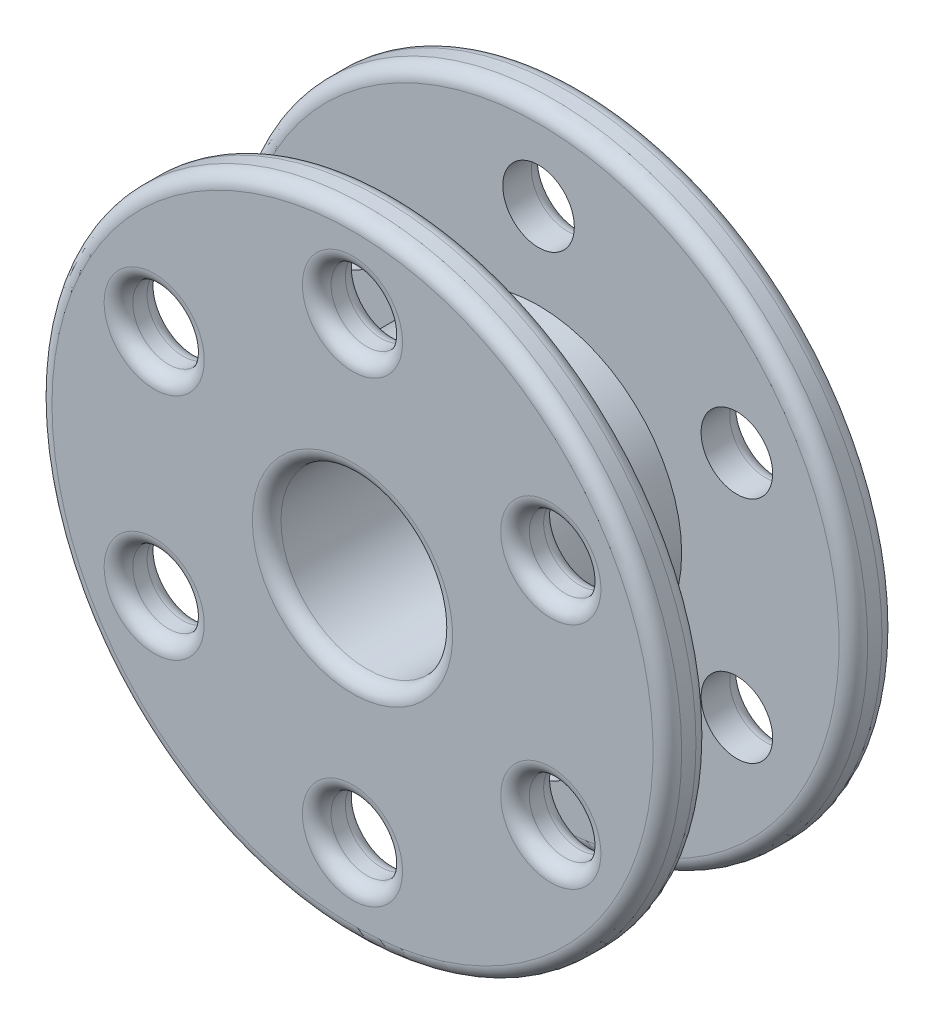
ISO-10303-21;
HEADER;
FILE_DESCRIPTION(('STEP AP214'),'2;1');
FILE_NAME('part.step','',(''),(''),'','','');
FILE_SCHEMA(('AUTOMOTIVE_DESIGN { 1 0 10303 214 1 1 1 1 }'));
ENDSEC;
DATA;
#1=APPLICATION_CONTEXT('core data for automotive mechanical design processes');
#2=APPLICATION_PROTOCOL_DEFINITION('international standard','automotive_design',2000,#1);
#3=PRODUCT_CONTEXT('',#1,'mechanical');
#4=PRODUCT('Part','Part','',(#3));
#5=PRODUCT_RELATED_PRODUCT_CATEGORY('part','',(#4));
#6=PRODUCT_DEFINITION_FORMATION('','',#4);
#7=PRODUCT_DEFINITION_CONTEXT('part definition',#1,'design');
#8=PRODUCT_DEFINITION('design','',#6,#7);
#9=PRODUCT_DEFINITION_SHAPE('','',#8);
#10=(LENGTH_UNIT() NAMED_UNIT(*) SI_UNIT(.MILLI.,.METRE.));
#11=(NAMED_UNIT(*) PLANE_ANGLE_UNIT() SI_UNIT($,.RADIAN.));
#12=(NAMED_UNIT(*) SI_UNIT($,.STERADIAN.) SOLID_ANGLE_UNIT());
#13=UNCERTAINTY_MEASURE_WITH_UNIT(LENGTH_MEASURE(1.E-05),#10,'distance_accuracy_value','');
#14=(GEOMETRIC_REPRESENTATION_CONTEXT(3) GLOBAL_UNCERTAINTY_ASSIGNED_CONTEXT((#13)) GLOBAL_UNIT_ASSIGNED_CONTEXT((#10,
#11,#12)) REPRESENTATION_CONTEXT('',''));
#15=CARTESIAN_POINT('',(0.,0.,0.));
#16=DIRECTION('',(0.,0.,1.));
#17=DIRECTION('',(1.,0.,0.));
#18=AXIS2_PLACEMENT_3D('',#15,#16,#17);
#19=CARTESIAN_POINT('',(0.,22.,5.));
#20=DIRECTION('',(0.,0.,1.));
#21=DIRECTION('',(1.,0.,0.));
#22=AXIS2_PLACEMENT_3D('',#19,#20,#21);
#23=PLANE('',#22);
#24=CARTESIAN_POINT('',(0.,0.,5.));
#25=DIRECTION('',(0.,0.,1.));
#26=DIRECTION('',(1.,0.,0.));
#27=AXIS2_PLACEMENT_3D('',#24,#25,#26);
#28=CIRCLE('',#27,11.);
#29=CARTESIAN_POINT('',(11.,0.,5.));
#30=VERTEX_POINT('',#29);
#31=EDGE_CURVE('E156',#30,#30,#28,.T.);
#32=ORIENTED_EDGE('',*,*,#31,.T.);
#33=EDGE_LOOP('',(#32));
#34=FACE_BOUND('',#33,.T.);
#35=CARTESIAN_POINT('',(0.,0.,5.));
#36=DIRECTION('',(0.,0.,1.));
#37=DIRECTION('',(1.,0.,0.));
#38=AXIS2_PLACEMENT_3D('',#35,#36,#37);
#39=CIRCLE('',#38,21.);
#40=CARTESIAN_POINT('',(21.,0.,5.));
#41=VERTEX_POINT('',#40);
#42=EDGE_CURVE('E159',#41,#41,#39,.F.);
#43=ORIENTED_EDGE('',*,*,#42,.T.);
#44=EDGE_LOOP('',(#43));
#45=FACE_BOUND('',#44,.T.);
#46=CARTESIAN_POINT('',(13.8564064605515,8.00000000000079,5.));
#47=DIRECTION('',(0.,0.,1.));
#48=DIRECTION('',(1.,0.,0.));
#49=AXIS2_PLACEMENT_3D('',#46,#47,#48);
#50=CIRCLE('',#49,3.50000000000024);
#51=CARTESIAN_POINT('',(17.3564064605517,8.00000000000079,5.));
#52=VERTEX_POINT('',#51);
#53=EDGE_CURVE('E162',#52,#52,#50,.T.);
#54=ORIENTED_EDGE('',*,*,#53,.T.);
#55=EDGE_LOOP('',(#54));
#56=FACE_BOUND('',#55,.T.);
#57=CARTESIAN_POINT('',(13.8564064605524,-7.99999999999921,5.));
#58=DIRECTION('',(0.,0.,1.));
#59=DIRECTION('',(1.,0.,0.));
#60=AXIS2_PLACEMENT_3D('',#57,#58,#59);
#61=CIRCLE('',#60,3.50000000000115);
#62=CARTESIAN_POINT('',(17.3564064605535,-7.99999999999921,5.));
#63=VERTEX_POINT('',#62);
#64=EDGE_CURVE('E165',#63,#63,#61,.T.);
#65=ORIENTED_EDGE('',*,*,#64,.T.);
#66=EDGE_LOOP('',(#65));
#67=FACE_BOUND('',#66,.T.);
#68=CARTESIAN_POINT('',(1.81311109890995E-12,-16.,5.));
#69=DIRECTION('',(0.,0.,1.));
#70=DIRECTION('',(1.,0.,0.));
#71=AXIS2_PLACEMENT_3D('',#68,#69,#70);
#72=CIRCLE('',#71,3.50000000000184);
#73=CARTESIAN_POINT('',(3.50000000000365,-16.,5.));
#74=VERTEX_POINT('',#73);
#75=EDGE_CURVE('E168',#74,#74,#72,.T.);
#76=ORIENTED_EDGE('',*,*,#75,.T.);
#77=EDGE_LOOP('',(#76));
#78=FACE_BOUND('',#77,.T.);
#79=CARTESIAN_POINT('',(-13.8564064605497,-8.00000000000079,5.));
#80=DIRECTION('',(0.,0.,1.));
#81=DIRECTION('',(1.,0.,0.));
#82=AXIS2_PLACEMENT_3D('',#79,#80,#81);
#83=CIRCLE('',#82,3.50000000000168);
#84=CARTESIAN_POINT('',(-10.356406460548,-8.00000000000079,5.));
#85=VERTEX_POINT('',#84);
#86=EDGE_CURVE('E171',#85,#85,#83,.T.);
#87=ORIENTED_EDGE('',*,*,#86,.T.);
#88=EDGE_LOOP('',(#87));
#89=FACE_BOUND('',#88,.T.);
#90=CARTESIAN_POINT('',(-13.8564064605506,7.99999999999921,5.));
#91=DIRECTION('',(0.,0.,1.));
#92=DIRECTION('',(1.,0.,0.));
#93=AXIS2_PLACEMENT_3D('',#90,#91,#92);
#94=CIRCLE('',#93,3.50000000000085);
#95=CARTESIAN_POINT('',(-10.3564064605497,7.99999999999921,5.));
#96=VERTEX_POINT('',#95);
#97=EDGE_CURVE('E174',#96,#96,#94,.T.);
#98=ORIENTED_EDGE('',*,*,#97,.T.);
#99=EDGE_LOOP('',(#98));
#100=FACE_BOUND('',#99,.T.);
#101=CARTESIAN_POINT('',(0.,16.,5.));
#102=DIRECTION('',(0.,0.,1.));
#103=DIRECTION('',(1.,0.,0.));
#104=AXIS2_PLACEMENT_3D('',#101,#102,#103);
#105=CIRCLE('',#104,3.5);
#106=CARTESIAN_POINT('',(3.5,16.,5.));
#107=VERTEX_POINT('',#106);
#108=EDGE_CURVE('E177',#107,#107,#105,.T.);
#109=ORIENTED_EDGE('',*,*,#108,.T.);
#110=EDGE_LOOP('',(#109));
#111=FACE_BOUND('',#110,.T.);
#112=ADVANCED_FACE('F31',(#34,#45,#56,#67,#78,#89,#100,#111),#23,.F.);
#113=CARTESIAN_POINT('',(0.,0.,8.));
#114=DIRECTION('',(0.,0.,1.));
#115=DIRECTION('',(1.,0.,0.));
#116=AXIS2_PLACEMENT_3D('',#113,#114,#115);
#117=CYLINDRICAL_SURFACE('',#116,22.);
#118=CARTESIAN_POINT('',(0.,0.,6.));
#119=DIRECTION('',(0.,0.,1.));
#120=DIRECTION('',(1.,0.,0.));
#121=AXIS2_PLACEMENT_3D('',#118,#119,#120);
#122=CIRCLE('',#121,22.);
#123=CARTESIAN_POINT('',(22.,0.,6.));
#124=VERTEX_POINT('',#123);
#125=EDGE_CURVE('E147',#124,#124,#122,.T.);
#126=ORIENTED_EDGE('',*,*,#125,.T.);
#127=EDGE_LOOP('',(#126));
#128=FACE_BOUND('',#127,.T.);
#129=CARTESIAN_POINT('',(0.,0.,7.));
#130=DIRECTION('',(0.,0.,-1.));
#131=DIRECTION('',(-1.,0.,0.));
#132=AXIS2_PLACEMENT_3D('',#129,#130,#131);
#133=CIRCLE('',#132,22.);
#134=CARTESIAN_POINT('',(-22.,0.,7.));
#135=VERTEX_POINT('',#134);
#136=EDGE_CURVE('E150',#135,#135,#133,.T.);
#137=ORIENTED_EDGE('',*,*,#136,.T.);
#138=EDGE_LOOP('',(#137));
#139=FACE_BOUND('',#138,.T.);
#140=ADVANCED_FACE('F230',(#128,#139),#117,.T.);
#141=CARTESIAN_POINT('',(0.,6.,8.));
#142=DIRECTION('',(0.,0.,-1.));
#143=DIRECTION('',(-1.,0.,0.));
#144=AXIS2_PLACEMENT_3D('',#141,#142,#143);
#145=PLANE('',#144);
#146=CARTESIAN_POINT('',(0.,0.,8.));
#147=DIRECTION('',(0.,0.,-1.));
#148=DIRECTION('',(-1.,0.,0.));
#149=AXIS2_PLACEMENT_3D('',#146,#147,#148);
#150=CIRCLE('',#149,21.);
#151=CARTESIAN_POINT('',(-21.,0.,8.));
#152=VERTEX_POINT('',#151);
#153=EDGE_CURVE('E87',#152,#152,#150,.F.);
#154=ORIENTED_EDGE('',*,*,#153,.T.);
#155=EDGE_LOOP('',(#154));
#156=FACE_BOUND('',#155,.T.);
#157=CARTESIAN_POINT('',(0.,0.,8.));
#158=DIRECTION('',(0.,0.,-1.));
#159=DIRECTION('',(-1.,0.,0.));
#160=AXIS2_PLACEMENT_3D('',#157,#158,#159);
#161=CIRCLE('',#160,7.);
#162=CARTESIAN_POINT('',(-7.,0.,8.));
#163=VERTEX_POINT('',#162);
#164=EDGE_CURVE('E90',#163,#163,#161,.T.);
#165=ORIENTED_EDGE('',*,*,#164,.T.);
#166=EDGE_LOOP('',(#165));
#167=FACE_BOUND('',#166,.T.);
#168=CARTESIAN_POINT('',(13.8564064605515,8.00000000000079,8.));
#169=DIRECTION('',(0.,0.,-1.));
#170=DIRECTION('',(-1.,0.,0.));
#171=AXIS2_PLACEMENT_3D('',#168,#169,#170);
#172=CIRCLE('',#171,3.50000000000024);
#173=CARTESIAN_POINT('',(10.3564064605512,8.00000000000079,8.));
#174=VERTEX_POINT('',#173);
#175=EDGE_CURVE('E93',#174,#174,#172,.T.);
#176=ORIENTED_EDGE('',*,*,#175,.T.);
#177=EDGE_LOOP('',(#176));
#178=FACE_BOUND('',#177,.T.);
#179=CARTESIAN_POINT('',(13.8564064605524,-7.99999999999921,8.));
#180=DIRECTION('',(0.,0.,-1.));
#181=DIRECTION('',(-1.,0.,0.));
#182=AXIS2_PLACEMENT_3D('',#179,#180,#181);
#183=CIRCLE('',#182,3.50000000000115);
#184=CARTESIAN_POINT('',(10.3564064605512,-7.99999999999921,8.));
#185=VERTEX_POINT('',#184);
#186=EDGE_CURVE('E96',#185,#185,#183,.T.);
#187=ORIENTED_EDGE('',*,*,#186,.T.);
#188=EDGE_LOOP('',(#187));
#189=FACE_BOUND('',#188,.T.);
#190=CARTESIAN_POINT('',(1.81311109890995E-12,-16.,8.));
#191=DIRECTION('',(0.,0.,-1.));
#192=DIRECTION('',(-1.,0.,0.));
#193=AXIS2_PLACEMENT_3D('',#190,#191,#192);
#194=CIRCLE('',#193,3.50000000000184);
#195=CARTESIAN_POINT('',(-3.50000000000003,-16.,8.));
#196=VERTEX_POINT('',#195);
#197=EDGE_CURVE('E99',#196,#196,#194,.T.);
#198=ORIENTED_EDGE('',*,*,#197,.T.);
#199=EDGE_LOOP('',(#198));
#200=FACE_BOUND('',#199,.T.);
#201=CARTESIAN_POINT('',(-13.8564064605497,-8.00000000000079,8.));
#202=DIRECTION('',(0.,0.,-1.));
#203=DIRECTION('',(-1.,0.,0.));
#204=AXIS2_PLACEMENT_3D('',#201,#202,#203);
#205=CIRCLE('',#204,3.50000000000168);
#206=CARTESIAN_POINT('',(-17.3564064605513,-8.00000000000079,8.));
#207=VERTEX_POINT('',#206);
#208=EDGE_CURVE('E102',#207,#207,#205,.T.);
#209=ORIENTED_EDGE('',*,*,#208,.T.);
#210=EDGE_LOOP('',(#209));
#211=FACE_BOUND('',#210,.T.);
#212=CARTESIAN_POINT('',(-13.8564064605506,7.99999999999921,8.));
#213=DIRECTION('',(0.,0.,-1.));
#214=DIRECTION('',(-1.,0.,0.));
#215=AXIS2_PLACEMENT_3D('',#212,#213,#214);
#216=CIRCLE('',#215,3.50000000000085);
#217=CARTESIAN_POINT('',(-17.3564064605514,7.99999999999921,8.));
#218=VERTEX_POINT('',#217);
#219=EDGE_CURVE('E105',#218,#218,#216,.T.);
#220=ORIENTED_EDGE('',*,*,#219,.T.);
#221=EDGE_LOOP('',(#220));
#222=FACE_BOUND('',#221,.T.);
#223=CARTESIAN_POINT('',(0.,16.,8.));
#224=DIRECTION('',(0.,0.,-1.));
#225=DIRECTION('',(-1.,0.,0.));
#226=AXIS2_PLACEMENT_3D('',#223,#224,#225);
#227=CIRCLE('',#226,3.5);
#228=CARTESIAN_POINT('',(-3.5,16.,8.));
#229=VERTEX_POINT('',#228);
#230=EDGE_CURVE('E108',#229,#229,#227,.T.);
#231=ORIENTED_EDGE('',*,*,#230,.T.);
#232=EDGE_LOOP('',(#231));
#233=FACE_BOUND('',#232,.T.);
#234=ADVANCED_FACE('F236',(#156,#167,#178,#189,#200,#211,#222,#233),#145,.F.);
#235=CARTESIAN_POINT('',(0.,0.,8.));
#236=DIRECTION('',(0.,0.,1.));
#237=DIRECTION('',(1.,0.,0.));
#238=AXIS2_PLACEMENT_3D('',#235,#236,#237);
#239=CYLINDRICAL_SURFACE('',#238,6.);
#240=CARTESIAN_POINT('',(0.,0.,7.));
#241=DIRECTION('',(0.,0.,-1.));
#242=DIRECTION('',(-1.,0.,0.));
#243=AXIS2_PLACEMENT_3D('',#240,#241,#242);
#244=CIRCLE('',#243,6.);
#245=CARTESIAN_POINT('',(-6.,0.,7.));
#246=VERTEX_POINT('',#245);
#247=EDGE_CURVE('E81',#246,#246,#244,.F.);
#248=ORIENTED_EDGE('',*,*,#247,.T.);
#249=EDGE_LOOP('',(#248));
#250=FACE_BOUND('',#249,.T.);
#251=CARTESIAN_POINT('',(0.,0.,-7.));
#252=DIRECTION('',(0.,0.,1.));
#253=DIRECTION('',(1.,0.,0.));
#254=AXIS2_PLACEMENT_3D('',#251,#252,#253);
#255=CIRCLE('',#254,6.);
#256=CARTESIAN_POINT('',(6.,0.,-7.));
#257=VERTEX_POINT('',#256);
#258=EDGE_CURVE('E84',#257,#257,#255,.F.);
#259=ORIENTED_EDGE('',*,*,#258,.T.);
#260=EDGE_LOOP('',(#259));
#261=FACE_BOUND('',#260,.T.);
#262=ADVANCED_FACE('F346',(#250,#261),#239,.F.);
#263=CARTESIAN_POINT('',(0.,22.,-8.));
#264=DIRECTION('',(0.,0.,1.));
#265=DIRECTION('',(1.,0.,0.));
#266=AXIS2_PLACEMENT_3D('',#263,#264,#265);
#267=PLANE('',#266);
#268=CARTESIAN_POINT('',(0.,0.,-8.));
#269=DIRECTION('',(0.,0.,1.));
#270=DIRECTION('',(1.,0.,0.));
#271=AXIS2_PLACEMENT_3D('',#268,#269,#270);
#272=CIRCLE('',#271,7.);
#273=CARTESIAN_POINT('',(7.,0.,-8.));
#274=VERTEX_POINT('',#273);
#275=EDGE_CURVE('E57',#274,#274,#272,.T.);
#276=ORIENTED_EDGE('',*,*,#275,.T.);
#277=EDGE_LOOP('',(#276));
#278=FACE_BOUND('',#277,.T.);
#279=CARTESIAN_POINT('',(0.,0.,-8.));
#280=DIRECTION('',(0.,0.,1.));
#281=DIRECTION('',(1.,0.,0.));
#282=AXIS2_PLACEMENT_3D('',#279,#280,#281);
#283=CIRCLE('',#282,21.);
#284=CARTESIAN_POINT('',(21.,0.,-8.));
#285=VERTEX_POINT('',#284);
#286=EDGE_CURVE('E60',#285,#285,#283,.F.);
#287=ORIENTED_EDGE('',*,*,#286,.T.);
#288=EDGE_LOOP('',(#287));
#289=FACE_BOUND('',#288,.T.);
#290=CARTESIAN_POINT('',(13.8564064605515,8.00000000000079,-8.));
#291=DIRECTION('',(0.,0.,1.));
#292=DIRECTION('',(1.,0.,0.));
#293=AXIS2_PLACEMENT_3D('',#290,#291,#292);
#294=CIRCLE('',#293,3.50000000000024);
#295=CARTESIAN_POINT('',(17.3564064605517,8.00000000000079,-8.));
#296=VERTEX_POINT('',#295);
#297=EDGE_CURVE('E63',#296,#296,#294,.T.);
#298=ORIENTED_EDGE('',*,*,#297,.T.);
#299=EDGE_LOOP('',(#298));
#300=FACE_BOUND('',#299,.T.);
#301=CARTESIAN_POINT('',(13.8564064605524,-7.99999999999921,-8.));
#302=DIRECTION('',(0.,0.,1.));
#303=DIRECTION('',(1.,0.,0.));
#304=AXIS2_PLACEMENT_3D('',#301,#302,#303);
#305=CIRCLE('',#304,3.50000000000115);
#306=CARTESIAN_POINT('',(17.3564064605535,-7.99999999999921,-8.));
#307=VERTEX_POINT('',#306);
#308=EDGE_CURVE('E66',#307,#307,#305,.T.);
#309=ORIENTED_EDGE('',*,*,#308,.T.);
#310=EDGE_LOOP('',(#309));
#311=FACE_BOUND('',#310,.T.);
#312=CARTESIAN_POINT('',(1.81311109890995E-12,-16.,-8.));
#313=DIRECTION('',(0.,0.,1.));
#314=DIRECTION('',(1.,0.,0.));
#315=AXIS2_PLACEMENT_3D('',#312,#313,#314);
#316=CIRCLE('',#315,3.50000000000184);
#317=CARTESIAN_POINT('',(3.50000000000365,-16.,-8.));
#318=VERTEX_POINT('',#317);
#319=EDGE_CURVE('E69',#318,#318,#316,.T.);
#320=ORIENTED_EDGE('',*,*,#319,.T.);
#321=EDGE_LOOP('',(#320));
#322=FACE_BOUND('',#321,.T.);
#323=CARTESIAN_POINT('',(-13.8564064605497,-8.00000000000079,-8.));
#324=DIRECTION('',(0.,0.,1.));
#325=DIRECTION('',(1.,0.,0.));
#326=AXIS2_PLACEMENT_3D('',#323,#324,#325);
#327=CIRCLE('',#326,3.50000000000168);
#328=CARTESIAN_POINT('',(-10.356406460548,-8.00000000000079,-8.));
#329=VERTEX_POINT('',#328);
#330=EDGE_CURVE('E72',#329,#329,#327,.T.);
#331=ORIENTED_EDGE('',*,*,#330,.T.);
#332=EDGE_LOOP('',(#331));
#333=FACE_BOUND('',#332,.T.);
#334=CARTESIAN_POINT('',(-13.8564064605506,7.99999999999921,-8.));
#335=DIRECTION('',(0.,0.,1.));
#336=DIRECTION('',(1.,0.,0.));
#337=AXIS2_PLACEMENT_3D('',#334,#335,#336);
#338=CIRCLE('',#337,3.50000000000085);
#339=CARTESIAN_POINT('',(-10.3564064605497,7.99999999999921,-8.));
#340=VERTEX_POINT('',#339);
#341=EDGE_CURVE('E75',#340,#340,#338,.T.);
#342=ORIENTED_EDGE('',*,*,#341,.T.);
#343=EDGE_LOOP('',(#342));
#344=FACE_BOUND('',#343,.T.);
#345=CARTESIAN_POINT('',(0.,16.,-8.));
#346=DIRECTION('',(0.,0.,1.));
#347=DIRECTION('',(1.,0.,0.));
#348=AXIS2_PLACEMENT_3D('',#345,#346,#347);
#349=CIRCLE('',#348,3.5);
#350=CARTESIAN_POINT('',(3.5,16.,-8.));
#351=VERTEX_POINT('',#350);
#352=EDGE_CURVE('E78',#351,#351,#349,.T.);
#353=ORIENTED_EDGE('',*,*,#352,.T.);
#354=EDGE_LOOP('',(#353));
#355=FACE_BOUND('',#354,.T.);
#356=ADVANCED_FACE('F225',(#278,#289,#300,#311,#322,#333,#344,#355),#267,.F.);
#357=CARTESIAN_POINT('',(0.,0.,8.));
#358=DIRECTION('',(0.,0.,1.));
#359=DIRECTION('',(1.,0.,0.));
#360=AXIS2_PLACEMENT_3D('',#357,#358,#359);
#361=CYLINDRICAL_SURFACE('',#360,22.);
#362=CARTESIAN_POINT('',(0.,0.,-6.));
#363=DIRECTION('',(0.,0.,-1.));
#364=DIRECTION('',(-1.,0.,0.));
#365=AXIS2_PLACEMENT_3D('',#362,#363,#364);
#366=CIRCLE('',#365,22.);
#367=CARTESIAN_POINT('',(-22.,0.,-6.));
#368=VERTEX_POINT('',#367);
#369=EDGE_CURVE('E180',#368,#368,#366,.T.);
#370=ORIENTED_EDGE('',*,*,#369,.T.);
#371=EDGE_LOOP('',(#370));
#372=FACE_BOUND('',#371,.T.);
#373=CARTESIAN_POINT('',(0.,0.,-7.));
#374=DIRECTION('',(0.,0.,1.));
#375=DIRECTION('',(1.,0.,0.));
#376=AXIS2_PLACEMENT_3D('',#373,#374,#375);
#377=CIRCLE('',#376,22.);
#378=CARTESIAN_POINT('',(22.,0.,-7.));
#379=VERTEX_POINT('',#378);
#380=EDGE_CURVE('E183',#379,#379,#377,.T.);
#381=ORIENTED_EDGE('',*,*,#380,.T.);
#382=EDGE_LOOP('',(#381));
#383=FACE_BOUND('',#382,.T.);
#384=ADVANCED_FACE('F215',(#372,#383),#361,.T.);
#385=CARTESIAN_POINT('',(0.,10.,-5.));
#386=DIRECTION('',(0.,0.,-1.));
#387=DIRECTION('',(-1.,0.,0.));
#388=AXIS2_PLACEMENT_3D('',#385,#386,#387);
#389=PLANE('',#388);
#390=CARTESIAN_POINT('',(0.,0.,-5.));
#391=DIRECTION('',(0.,0.,-1.));
#392=DIRECTION('',(-1.,0.,0.));
#393=AXIS2_PLACEMENT_3D('',#390,#391,#392);
#394=CIRCLE('',#393,21.);
#395=CARTESIAN_POINT('',(-21.,0.,-5.));
#396=VERTEX_POINT('',#395);
#397=EDGE_CURVE('E186',#396,#396,#394,.F.);
#398=ORIENTED_EDGE('',*,*,#397,.T.);
#399=EDGE_LOOP('',(#398));
#400=FACE_BOUND('',#399,.T.);
#401=CARTESIAN_POINT('',(0.,16.,-5.));
#402=DIRECTION('',(0.,0.,-1.));
#403=DIRECTION('',(-1.,0.,0.));
#404=AXIS2_PLACEMENT_3D('',#401,#402,#403);
#405=CIRCLE('',#404,2.5);
#406=CARTESIAN_POINT('',(-2.5,16.,-5.));
#407=VERTEX_POINT('',#406);
#408=EDGE_CURVE('E190',#407,#407,#405,.T.);
#409=ORIENTED_EDGE('',*,*,#408,.T.);
#410=EDGE_LOOP('',(#409));
#411=FACE_BOUND('',#410,.T.);
#412=CARTESIAN_POINT('',(-13.8564064605506,7.99999999999921,-5.));
#413=DIRECTION('',(0.,0.,-1.));
#414=DIRECTION('',(-1.,0.,0.));
#415=AXIS2_PLACEMENT_3D('',#412,#413,#414);
#416=CIRCLE('',#415,2.50000000000085);
#417=CARTESIAN_POINT('',(-16.3564064605514,7.99999999999921,-5.));
#418=VERTEX_POINT('',#417);
#419=EDGE_CURVE('E193',#418,#418,#416,.T.);
#420=ORIENTED_EDGE('',*,*,#419,.T.);
#421=EDGE_LOOP('',(#420));
#422=FACE_BOUND('',#421,.T.);
#423=CARTESIAN_POINT('',(-13.8564064605497,-8.00000000000079,-5.));
#424=DIRECTION('',(0.,0.,-1.));
#425=DIRECTION('',(-1.,0.,0.));
#426=AXIS2_PLACEMENT_3D('',#423,#424,#425);
#427=CIRCLE('',#426,2.50000000000168);
#428=CARTESIAN_POINT('',(-16.3564064605513,-8.00000000000079,-5.));
#429=VERTEX_POINT('',#428);
#430=EDGE_CURVE('E196',#429,#429,#427,.T.);
#431=ORIENTED_EDGE('',*,*,#430,.T.);
#432=EDGE_LOOP('',(#431));
#433=FACE_BOUND('',#432,.T.);
#434=CARTESIAN_POINT('',(1.81311109890995E-12,-16.,-5.));
#435=DIRECTION('',(0.,0.,-1.));
#436=DIRECTION('',(-1.,0.,0.));
#437=AXIS2_PLACEMENT_3D('',#434,#435,#436);
#438=CIRCLE('',#437,2.50000000000184);
#439=CARTESIAN_POINT('',(-2.50000000000003,-16.,-5.));
#440=VERTEX_POINT('',#439);
#441=EDGE_CURVE('E199',#440,#440,#438,.T.);
#442=ORIENTED_EDGE('',*,*,#441,.T.);
#443=EDGE_LOOP('',(#442));
#444=FACE_BOUND('',#443,.T.);
#445=CARTESIAN_POINT('',(13.8564064605524,-7.99999999999921,-5.));
#446=DIRECTION('',(0.,0.,-1.));
#447=DIRECTION('',(-1.,0.,0.));
#448=AXIS2_PLACEMENT_3D('',#445,#446,#447);
#449=CIRCLE('',#448,2.50000000000115);
#450=CARTESIAN_POINT('',(11.3564064605512,-7.99999999999921,-5.));
#451=VERTEX_POINT('',#450);
#452=EDGE_CURVE('E202',#451,#451,#449,.T.);
#453=ORIENTED_EDGE('',*,*,#452,.T.);
#454=EDGE_LOOP('',(#453));
#455=FACE_BOUND('',#454,.T.);
#456=CARTESIAN_POINT('',(13.8564064605515,8.00000000000079,-5.));
#457=DIRECTION('',(0.,0.,-1.));
#458=DIRECTION('',(-1.,0.,0.));
#459=AXIS2_PLACEMENT_3D('',#456,#457,#458);
#460=CIRCLE('',#459,2.50000000000024);
#461=CARTESIAN_POINT('',(11.3564064605512,8.00000000000079,-5.));
#462=VERTEX_POINT('',#461);
#463=EDGE_CURVE('E205',#462,#462,#460,.T.);
#464=ORIENTED_EDGE('',*,*,#463,.T.);
#465=EDGE_LOOP('',(#464));
#466=FACE_BOUND('',#465,.T.);
#467=CARTESIAN_POINT('',(0.,0.,-5.));
#468=DIRECTION('',(0.,0.,1.));
#469=DIRECTION('',(1.,0.,0.));
#470=AXIS2_PLACEMENT_3D('',#467,#468,#469);
#471=CIRCLE('',#470,10.);
#472=CARTESIAN_POINT('',(10.,0.,-5.));
#473=VERTEX_POINT('',#472);
#474=EDGE_CURVE('E189',#473,#473,#471,.T.);
#475=ORIENTED_EDGE('',*,*,#474,.F.);
#476=EDGE_LOOP('',(#475));
#477=FACE_BOUND('',#476,.T.);
#478=ADVANCED_FACE('F213',(#400,#411,#422,#433,#444,#455,#466,#477),#389,.F.);
#479=CARTESIAN_POINT('',(0.,0.,8.));
#480=DIRECTION('',(0.,0.,1.));
#481=DIRECTION('',(1.,0.,0.));
#482=AXIS2_PLACEMENT_3D('',#479,#480,#481);
#483=CYLINDRICAL_SURFACE('',#482,10.);
#484=CARTESIAN_POINT('',(0.,0.,4.));
#485=DIRECTION('',(0.,0.,1.));
#486=DIRECTION('',(1.,0.,0.));
#487=AXIS2_PLACEMENT_3D('',#484,#485,#486);
#488=CIRCLE('',#487,10.);
#489=CARTESIAN_POINT('',(10.,0.,4.));
#490=VERTEX_POINT('',#489);
#491=EDGE_CURVE('E153',#490,#490,#488,.F.);
#492=ORIENTED_EDGE('',*,*,#491,.T.);
#493=EDGE_LOOP('',(#492));
#494=FACE_BOUND('',#493,.T.);
#495=ORIENTED_EDGE('',*,*,#474,.T.);
#496=EDGE_LOOP('',(#495));
#497=FACE_BOUND('',#496,.T.);
#498=ADVANCED_FACE('F211',(#494,#497),#483,.T.);
#499=CARTESIAN_POINT('',(13.8564064605515,8.00000000000079,-8.));
#500=DIRECTION('',(0.,0.,1.));
#501=DIRECTION('',(1.,0.,0.));
#502=AXIS2_PLACEMENT_3D('',#499,#500,#501);
#503=CYLINDRICAL_SURFACE('',#502,2.50000000000024);
#504=CARTESIAN_POINT('',(13.8564064605515,8.00000000000079,-7.));
#505=DIRECTION('',(0.,0.,1.));
#506=DIRECTION('',(1.,0.,0.));
#507=AXIS2_PLACEMENT_3D('',#504,#505,#506);
#508=CIRCLE('',#507,2.50000000000024);
#509=CARTESIAN_POINT('',(16.3564064605517,8.00000000000079,-7.));
#510=VERTEX_POINT('',#509);
#511=EDGE_CURVE('E54',#510,#510,#508,.F.);
#512=ORIENTED_EDGE('',*,*,#511,.T.);
#513=EDGE_LOOP('',(#512));
#514=FACE_BOUND('',#513,.T.);
#515=ORIENTED_EDGE('',*,*,#463,.F.);
#516=EDGE_LOOP('',(#515));
#517=FACE_BOUND('',#516,.T.);
#518=ADVANCED_FACE('F222',(#514,#517),#503,.F.);
#519=CARTESIAN_POINT('',(13.8564064605524,-7.99999999999921,-8.));
#520=DIRECTION('',(0.,0.,1.));
#521=DIRECTION('',(1.,0.,0.));
#522=AXIS2_PLACEMENT_3D('',#519,#520,#521);
#523=CYLINDRICAL_SURFACE('',#522,2.50000000000115);
#524=CARTESIAN_POINT('',(13.8564064605524,-7.99999999999921,-7.));
#525=DIRECTION('',(0.,0.,1.));
#526=DIRECTION('',(1.,0.,0.));
#527=AXIS2_PLACEMENT_3D('',#524,#525,#526);
#528=CIRCLE('',#527,2.50000000000115);
#529=CARTESIAN_POINT('',(16.3564064605535,-7.99999999999921,-7.));
#530=VERTEX_POINT('',#529);
#531=EDGE_CURVE('E51',#530,#530,#528,.F.);
#532=ORIENTED_EDGE('',*,*,#531,.T.);
#533=EDGE_LOOP('',(#532));
#534=FACE_BOUND('',#533,.T.);
#535=ORIENTED_EDGE('',*,*,#452,.F.);
#536=EDGE_LOOP('',(#535));
#537=FACE_BOUND('',#536,.T.);
#538=ADVANCED_FACE('F424',(#534,#537),#523,.F.);
#539=CARTESIAN_POINT('',(1.81311109890995E-12,-16.,-8.));
#540=DIRECTION('',(0.,0.,1.));
#541=DIRECTION('',(1.,0.,0.));
#542=AXIS2_PLACEMENT_3D('',#539,#540,#541);
#543=CYLINDRICAL_SURFACE('',#542,2.50000000000184);
#544=CARTESIAN_POINT('',(1.81311109890995E-12,-16.,-7.));
#545=DIRECTION('',(0.,0.,1.));
#546=DIRECTION('',(1.,0.,0.));
#547=AXIS2_PLACEMENT_3D('',#544,#545,#546);
#548=CIRCLE('',#547,2.50000000000184);
#549=CARTESIAN_POINT('',(2.50000000000365,-16.,-7.));
#550=VERTEX_POINT('',#549);
#551=EDGE_CURVE('E46',#550,#550,#548,.F.);
#552=ORIENTED_EDGE('',*,*,#551,.T.);
#553=EDGE_LOOP('',(#552));
#554=FACE_BOUND('',#553,.T.);
#555=ORIENTED_EDGE('',*,*,#441,.F.);
#556=EDGE_LOOP('',(#555));
#557=FACE_BOUND('',#556,.T.);
#558=ADVANCED_FACE('F435',(#554,#557),#543,.F.);
#559=CARTESIAN_POINT('',(-13.8564064605497,-8.00000000000079,-8.));
#560=DIRECTION('',(0.,0.,1.));
#561=DIRECTION('',(1.,0.,0.));
#562=AXIS2_PLACEMENT_3D('',#559,#560,#561);
#563=CYLINDRICAL_SURFACE('',#562,2.50000000000168);
#564=CARTESIAN_POINT('',(-13.8564064605497,-8.00000000000079,-7.));
#565=DIRECTION('',(0.,0.,1.));
#566=DIRECTION('',(1.,0.,0.));
#567=AXIS2_PLACEMENT_3D('',#564,#565,#566);
#568=CIRCLE('',#567,2.50000000000168);
#569=CARTESIAN_POINT('',(-11.356406460548,-8.00000000000079,-7.));
#570=VERTEX_POINT('',#569);
#571=EDGE_CURVE('E42',#570,#570,#568,.F.);
#572=ORIENTED_EDGE('',*,*,#571,.T.);
#573=EDGE_LOOP('',(#572));
#574=FACE_BOUND('',#573,.T.);
#575=ORIENTED_EDGE('',*,*,#430,.F.);
#576=EDGE_LOOP('',(#575));
#577=FACE_BOUND('',#576,.T.);
#578=ADVANCED_FACE('F446',(#574,#577),#563,.F.);
#579=CARTESIAN_POINT('',(-13.8564064605506,7.99999999999921,-8.));
#580=DIRECTION('',(0.,0.,1.));
#581=DIRECTION('',(1.,0.,0.));
#582=AXIS2_PLACEMENT_3D('',#579,#580,#581);
#583=CYLINDRICAL_SURFACE('',#582,2.50000000000085);
#584=CARTESIAN_POINT('',(-13.8564064605506,7.99999999999921,-7.));
#585=DIRECTION('',(0.,0.,1.));
#586=DIRECTION('',(1.,0.,0.));
#587=AXIS2_PLACEMENT_3D('',#584,#585,#586);
#588=CIRCLE('',#587,2.50000000000085);
#589=CARTESIAN_POINT('',(-11.3564064605497,7.99999999999921,-7.));
#590=VERTEX_POINT('',#589);
#591=EDGE_CURVE('E38',#590,#590,#588,.F.);
#592=ORIENTED_EDGE('',*,*,#591,.T.);
#593=EDGE_LOOP('',(#592));
#594=FACE_BOUND('',#593,.T.);
#595=ORIENTED_EDGE('',*,*,#419,.F.);
#596=EDGE_LOOP('',(#595));
#597=FACE_BOUND('',#596,.T.);
#598=ADVANCED_FACE('F457',(#594,#597),#583,.F.);
#599=CARTESIAN_POINT('',(0.,16.,-8.));
#600=DIRECTION('',(0.,0.,1.));
#601=DIRECTION('',(1.,0.,0.));
#602=AXIS2_PLACEMENT_3D('',#599,#600,#601);
#603=CYLINDRICAL_SURFACE('',#602,2.5);
#604=CARTESIAN_POINT('',(0.,16.,-7.));
#605=DIRECTION('',(0.,0.,1.));
#606=DIRECTION('',(1.,0.,0.));
#607=AXIS2_PLACEMENT_3D('',#604,#605,#606);
#608=CIRCLE('',#607,2.5);
#609=CARTESIAN_POINT('',(2.5,16.,-7.));
#610=VERTEX_POINT('',#609);
#611=EDGE_CURVE('E10',#610,#610,#608,.F.);
#612=ORIENTED_EDGE('',*,*,#611,.T.);
#613=EDGE_LOOP('',(#612));
#614=FACE_BOUND('',#613,.T.);
#615=ORIENTED_EDGE('',*,*,#408,.F.);
#616=EDGE_LOOP('',(#615));
#617=FACE_BOUND('',#616,.T.);
#618=ADVANCED_FACE('F468',(#614,#617),#603,.F.);
#619=CARTESIAN_POINT('',(13.8564064605515,8.00000000000079,6.));
#620=DIRECTION('',(0.,0.,1.));
#621=DIRECTION('',(1.,0.,0.));
#622=AXIS2_PLACEMENT_3D('',#619,#620,#621);
#623=CIRCLE('',#622,2.50000000000024);
#624=CARTESIAN_POINT('',(16.3564064605517,8.00000000000079,6.));
#625=VERTEX_POINT('',#624);
#626=EDGE_CURVE('E141',#625,#625,#623,.F.);
#627=ORIENTED_EDGE('',*,*,#626,.T.);
#628=EDGE_LOOP('',(#627));
#629=FACE_BOUND('',#628,.T.);
#630=CARTESIAN_POINT('',(13.8564064605515,8.00000000000079,7.));
#631=DIRECTION('',(0.,0.,-1.));
#632=DIRECTION('',(-1.,0.,0.));
#633=AXIS2_PLACEMENT_3D('',#630,#631,#632);
#634=CIRCLE('',#633,2.50000000000024);
#635=CARTESIAN_POINT('',(11.3564064605512,8.00000000000079,7.));
#636=VERTEX_POINT('',#635);
#637=EDGE_CURVE('E144',#636,#636,#634,.F.);
#638=ORIENTED_EDGE('',*,*,#637,.T.);
#639=EDGE_LOOP('',(#638));
#640=FACE_BOUND('',#639,.T.);
#641=ADVANCED_FACE('F427',(#629,#640),#503,.F.);
#642=CARTESIAN_POINT('',(13.8564064605524,-7.99999999999921,6.));
#643=DIRECTION('',(0.,0.,1.));
#644=DIRECTION('',(1.,0.,0.));
#645=AXIS2_PLACEMENT_3D('',#642,#643,#644);
#646=CIRCLE('',#645,2.50000000000115);
#647=CARTESIAN_POINT('',(16.3564064605535,-7.99999999999921,6.));
#648=VERTEX_POINT('',#647);
#649=EDGE_CURVE('E135',#648,#648,#646,.F.);
#650=ORIENTED_EDGE('',*,*,#649,.T.);
#651=EDGE_LOOP('',(#650));
#652=FACE_BOUND('',#651,.T.);
#653=CARTESIAN_POINT('',(13.8564064605524,-7.99999999999921,7.));
#654=DIRECTION('',(0.,0.,-1.));
#655=DIRECTION('',(-1.,0.,0.));
#656=AXIS2_PLACEMENT_3D('',#653,#654,#655);
#657=CIRCLE('',#656,2.50000000000115);
#658=CARTESIAN_POINT('',(11.3564064605512,-7.99999999999921,7.));
#659=VERTEX_POINT('',#658);
#660=EDGE_CURVE('E138',#659,#659,#657,.F.);
#661=ORIENTED_EDGE('',*,*,#660,.T.);
#662=EDGE_LOOP('',(#661));
#663=FACE_BOUND('',#662,.T.);
#664=ADVANCED_FACE('F438',(#652,#663),#523,.F.);
#665=CARTESIAN_POINT('',(1.81311109890995E-12,-16.,6.));
#666=DIRECTION('',(0.,0.,1.));
#667=DIRECTION('',(1.,0.,0.));
#668=AXIS2_PLACEMENT_3D('',#665,#666,#667);
#669=CIRCLE('',#668,2.50000000000184);
#670=CARTESIAN_POINT('',(2.50000000000365,-16.,6.));
#671=VERTEX_POINT('',#670);
#672=EDGE_CURVE('E129',#671,#671,#669,.F.);
#673=ORIENTED_EDGE('',*,*,#672,.T.);
#674=EDGE_LOOP('',(#673));
#675=FACE_BOUND('',#674,.T.);
#676=CARTESIAN_POINT('',(1.81311109890995E-12,-16.,7.));
#677=DIRECTION('',(0.,0.,-1.));
#678=DIRECTION('',(-1.,0.,0.));
#679=AXIS2_PLACEMENT_3D('',#676,#677,#678);
#680=CIRCLE('',#679,2.50000000000184);
#681=CARTESIAN_POINT('',(-2.50000000000003,-16.,7.));
#682=VERTEX_POINT('',#681);
#683=EDGE_CURVE('E132',#682,#682,#680,.F.);
#684=ORIENTED_EDGE('',*,*,#683,.T.);
#685=EDGE_LOOP('',(#684));
#686=FACE_BOUND('',#685,.T.);
#687=ADVANCED_FACE('F449',(#675,#686),#543,.F.);
#688=CARTESIAN_POINT('',(-13.8564064605497,-8.00000000000079,6.));
#689=DIRECTION('',(0.,0.,1.));
#690=DIRECTION('',(1.,0.,0.));
#691=AXIS2_PLACEMENT_3D('',#688,#689,#690);
#692=CIRCLE('',#691,2.50000000000168);
#693=CARTESIAN_POINT('',(-11.356406460548,-8.00000000000079,6.));
#694=VERTEX_POINT('',#693);
#695=EDGE_CURVE('E123',#694,#694,#692,.F.);
#696=ORIENTED_EDGE('',*,*,#695,.T.);
#697=EDGE_LOOP('',(#696));
#698=FACE_BOUND('',#697,.T.);
#699=CARTESIAN_POINT('',(-13.8564064605497,-8.00000000000079,7.));
#700=DIRECTION('',(0.,0.,-1.));
#701=DIRECTION('',(-1.,0.,0.));
#702=AXIS2_PLACEMENT_3D('',#699,#700,#701);
#703=CIRCLE('',#702,2.50000000000168);
#704=CARTESIAN_POINT('',(-16.3564064605513,-8.00000000000079,7.));
#705=VERTEX_POINT('',#704);
#706=EDGE_CURVE('E126',#705,#705,#703,.F.);
#707=ORIENTED_EDGE('',*,*,#706,.T.);
#708=EDGE_LOOP('',(#707));
#709=FACE_BOUND('',#708,.T.);
#710=ADVANCED_FACE('F460',(#698,#709),#563,.F.);
#711=CARTESIAN_POINT('',(-13.8564064605506,7.99999999999921,6.));
#712=DIRECTION('',(0.,0.,1.));
#713=DIRECTION('',(1.,0.,0.));
#714=AXIS2_PLACEMENT_3D('',#711,#712,#713);
#715=CIRCLE('',#714,2.50000000000085);
#716=CARTESIAN_POINT('',(-11.3564064605497,7.99999999999921,6.));
#717=VERTEX_POINT('',#716);
#718=EDGE_CURVE('E117',#717,#717,#715,.F.);
#719=ORIENTED_EDGE('',*,*,#718,.T.);
#720=EDGE_LOOP('',(#719));
#721=FACE_BOUND('',#720,.T.);
#722=CARTESIAN_POINT('',(-13.8564064605506,7.99999999999921,7.));
#723=DIRECTION('',(0.,0.,-1.));
#724=DIRECTION('',(-1.,0.,0.));
#725=AXIS2_PLACEMENT_3D('',#722,#723,#724);
#726=CIRCLE('',#725,2.50000000000085);
#727=CARTESIAN_POINT('',(-16.3564064605514,7.99999999999921,7.));
#728=VERTEX_POINT('',#727);
#729=EDGE_CURVE('E120',#728,#728,#726,.F.);
#730=ORIENTED_EDGE('',*,*,#729,.T.);
#731=EDGE_LOOP('',(#730));
#732=FACE_BOUND('',#731,.T.);
#733=ADVANCED_FACE('F470',(#721,#732),#583,.F.);
#734=CARTESIAN_POINT('',(0.,16.,6.));
#735=DIRECTION('',(0.,0.,1.));
#736=DIRECTION('',(1.,0.,0.));
#737=AXIS2_PLACEMENT_3D('',#734,#735,#736);
#738=CIRCLE('',#737,2.5);
#739=CARTESIAN_POINT('',(2.5,16.,6.));
#740=VERTEX_POINT('',#739);
#741=EDGE_CURVE('E111',#740,#740,#738,.F.);
#742=ORIENTED_EDGE('',*,*,#741,.T.);
#743=EDGE_LOOP('',(#742));
#744=FACE_BOUND('',#743,.T.);
#745=CARTESIAN_POINT('',(0.,16.,7.));
#746=DIRECTION('',(0.,0.,-1.));
#747=DIRECTION('',(-1.,0.,0.));
#748=AXIS2_PLACEMENT_3D('',#745,#746,#747);
#749=CIRCLE('',#748,2.5);
#750=CARTESIAN_POINT('',(-2.5,16.,7.));
#751=VERTEX_POINT('',#750);
#752=EDGE_CURVE('E114',#751,#751,#749,.F.);
#753=ORIENTED_EDGE('',*,*,#752,.T.);
#754=EDGE_LOOP('',(#753));
#755=FACE_BOUND('',#754,.T.);
#756=ADVANCED_FACE('F246',(#744,#755),#603,.F.);
#757=CARTESIAN_POINT('',(0.,0.,-6.));
#758=DIRECTION('',(0.,0.,-1.));
#759=DIRECTION('',(-1.,0.,0.));
#760=AXIS2_PLACEMENT_3D('',#757,#758,#759);
#761=TOROIDAL_SURFACE('',#760,21.,1.);
#762=ORIENTED_EDGE('',*,*,#369,.F.);
#763=EDGE_LOOP('',(#762));
#764=FACE_BOUND('',#763,.T.);
#765=ORIENTED_EDGE('',*,*,#397,.F.);
#766=EDGE_LOOP('',(#765));
#767=FACE_BOUND('',#766,.T.);
#768=ADVANCED_FACE('F242',(#764,#767),#761,.T.);
#769=CARTESIAN_POINT('',(0.,0.,4.));
#770=DIRECTION('',(0.,0.,1.));
#771=DIRECTION('',(1.,0.,0.));
#772=AXIS2_PLACEMENT_3D('',#769,#770,#771);
#773=TOROIDAL_SURFACE('',#772,11.,1.);
#774=ORIENTED_EDGE('',*,*,#491,.F.);
#775=EDGE_LOOP('',(#774));
#776=FACE_BOUND('',#775,.T.);
#777=ORIENTED_EDGE('',*,*,#31,.F.);
#778=EDGE_LOOP('',(#777));
#779=FACE_BOUND('',#778,.T.);
#780=ADVANCED_FACE('F245',(#776,#779),#773,.F.);
#781=CARTESIAN_POINT('',(0.,0.,6.));
#782=DIRECTION('',(0.,0.,1.));
#783=DIRECTION('',(1.,0.,0.));
#784=AXIS2_PLACEMENT_3D('',#781,#782,#783);
#785=TOROIDAL_SURFACE('',#784,21.,1.);
#786=ORIENTED_EDGE('',*,*,#42,.F.);
#787=EDGE_LOOP('',(#786));
#788=FACE_BOUND('',#787,.T.);
#789=ORIENTED_EDGE('',*,*,#125,.F.);
#790=EDGE_LOOP('',(#789));
#791=FACE_BOUND('',#790,.T.);
#792=ADVANCED_FACE('F250',(#788,#791),#785,.T.);
#793=CARTESIAN_POINT('',(13.8564064605515,8.00000000000079,6.));
#794=DIRECTION('',(0.,0.,1.));
#795=DIRECTION('',(1.,0.,0.));
#796=AXIS2_PLACEMENT_3D('',#793,#794,#795);
#797=TOROIDAL_SURFACE('',#796,3.50000000000024,1.);
#798=ORIENTED_EDGE('',*,*,#626,.F.);
#799=EDGE_LOOP('',(#798));
#800=FACE_BOUND('',#799,.T.);
#801=ORIENTED_EDGE('',*,*,#53,.F.);
#802=EDGE_LOOP('',(#801));
#803=FACE_BOUND('',#802,.T.);
#804=ADVANCED_FACE('F254',(#800,#803),#797,.T.);
#805=CARTESIAN_POINT('',(13.8564064605524,-7.99999999999921,6.));
#806=DIRECTION('',(0.,0.,1.));
#807=DIRECTION('',(1.,0.,0.));
#808=AXIS2_PLACEMENT_3D('',#805,#806,#807);
#809=TOROIDAL_SURFACE('',#808,3.50000000000115,1.);
#810=ORIENTED_EDGE('',*,*,#649,.F.);
#811=EDGE_LOOP('',(#810));
#812=FACE_BOUND('',#811,.T.);
#813=ORIENTED_EDGE('',*,*,#64,.F.);
#814=EDGE_LOOP('',(#813));
#815=FACE_BOUND('',#814,.T.);
#816=ADVANCED_FACE('F258',(#812,#815),#809,.T.);
#817=CARTESIAN_POINT('',(1.81311109890995E-12,-16.,6.));
#818=DIRECTION('',(0.,0.,1.));
#819=DIRECTION('',(1.,0.,0.));
#820=AXIS2_PLACEMENT_3D('',#817,#818,#819);
#821=TOROIDAL_SURFACE('',#820,3.50000000000184,1.);
#822=ORIENTED_EDGE('',*,*,#672,.F.);
#823=EDGE_LOOP('',(#822));
#824=FACE_BOUND('',#823,.T.);
#825=ORIENTED_EDGE('',*,*,#75,.F.);
#826=EDGE_LOOP('',(#825));
#827=FACE_BOUND('',#826,.T.);
#828=ADVANCED_FACE('F262',(#824,#827),#821,.T.);
#829=CARTESIAN_POINT('',(-13.8564064605497,-8.00000000000079,6.));
#830=DIRECTION('',(0.,0.,1.));
#831=DIRECTION('',(1.,0.,0.));
#832=AXIS2_PLACEMENT_3D('',#829,#830,#831);
#833=TOROIDAL_SURFACE('',#832,3.50000000000168,1.);
#834=ORIENTED_EDGE('',*,*,#695,.F.);
#835=EDGE_LOOP('',(#834));
#836=FACE_BOUND('',#835,.T.);
#837=ORIENTED_EDGE('',*,*,#86,.F.);
#838=EDGE_LOOP('',(#837));
#839=FACE_BOUND('',#838,.T.);
#840=ADVANCED_FACE('F266',(#836,#839),#833,.T.);
#841=CARTESIAN_POINT('',(-13.8564064605506,7.99999999999921,6.));
#842=DIRECTION('',(0.,0.,1.));
#843=DIRECTION('',(1.,0.,0.));
#844=AXIS2_PLACEMENT_3D('',#841,#842,#843);
#845=TOROIDAL_SURFACE('',#844,3.50000000000085,1.);
#846=ORIENTED_EDGE('',*,*,#718,.F.);
#847=EDGE_LOOP('',(#846));
#848=FACE_BOUND('',#847,.T.);
#849=ORIENTED_EDGE('',*,*,#97,.F.);
#850=EDGE_LOOP('',(#849));
#851=FACE_BOUND('',#850,.T.);
#852=ADVANCED_FACE('F270',(#848,#851),#845,.T.);
#853=CARTESIAN_POINT('',(0.,16.,6.));
#854=DIRECTION('',(0.,0.,1.));
#855=DIRECTION('',(1.,0.,0.));
#856=AXIS2_PLACEMENT_3D('',#853,#854,#855);
#857=TOROIDAL_SURFACE('',#856,3.5,1.);
#858=ORIENTED_EDGE('',*,*,#741,.F.);
#859=EDGE_LOOP('',(#858));
#860=FACE_BOUND('',#859,.T.);
#861=ORIENTED_EDGE('',*,*,#108,.F.);
#862=EDGE_LOOP('',(#861));
#863=FACE_BOUND('',#862,.T.);
#864=ADVANCED_FACE('F274',(#860,#863),#857,.T.);
#865=CARTESIAN_POINT('',(0.,0.,7.));
#866=DIRECTION('',(0.,0.,-1.));
#867=DIRECTION('',(-1.,0.,0.));
#868=AXIS2_PLACEMENT_3D('',#865,#866,#867);
#869=TOROIDAL_SURFACE('',#868,21.,1.);
#870=ORIENTED_EDGE('',*,*,#136,.F.);
#871=EDGE_LOOP('',(#870));
#872=FACE_BOUND('',#871,.T.);
#873=ORIENTED_EDGE('',*,*,#153,.F.);
#874=EDGE_LOOP('',(#873));
#875=FACE_BOUND('',#874,.T.);
#876=ADVANCED_FACE('F278',(#872,#875),#869,.T.);
#877=CARTESIAN_POINT('',(0.,0.,7.));
#878=DIRECTION('',(0.,0.,-1.));
#879=DIRECTION('',(-1.,0.,0.));
#880=AXIS2_PLACEMENT_3D('',#877,#878,#879);
#881=TOROIDAL_SURFACE('',#880,7.,1.);
#882=ORIENTED_EDGE('',*,*,#164,.F.);
#883=EDGE_LOOP('',(#882));
#884=FACE_BOUND('',#883,.T.);
#885=ORIENTED_EDGE('',*,*,#247,.F.);
#886=EDGE_LOOP('',(#885));
#887=FACE_BOUND('',#886,.T.);
#888=ADVANCED_FACE('F282',(#884,#887),#881,.T.);
#889=CARTESIAN_POINT('',(13.8564064605515,8.00000000000079,7.));
#890=DIRECTION('',(0.,0.,-1.));
#891=DIRECTION('',(-1.,0.,0.));
#892=AXIS2_PLACEMENT_3D('',#889,#890,#891);
#893=TOROIDAL_SURFACE('',#892,3.50000000000024,1.);
#894=ORIENTED_EDGE('',*,*,#637,.F.);
#895=EDGE_LOOP('',(#894));
#896=FACE_BOUND('',#895,.T.);
#897=ORIENTED_EDGE('',*,*,#175,.F.);
#898=EDGE_LOOP('',(#897));
#899=FACE_BOUND('',#898,.T.);
#900=ADVANCED_FACE('F286',(#896,#899),#893,.T.);
#901=CARTESIAN_POINT('',(13.8564064605524,-7.99999999999921,7.));
#902=DIRECTION('',(0.,0.,-1.));
#903=DIRECTION('',(-1.,0.,0.));
#904=AXIS2_PLACEMENT_3D('',#901,#902,#903);
#905=TOROIDAL_SURFACE('',#904,3.50000000000115,1.);
#906=ORIENTED_EDGE('',*,*,#660,.F.);
#907=EDGE_LOOP('',(#906));
#908=FACE_BOUND('',#907,.T.);
#909=ORIENTED_EDGE('',*,*,#186,.F.);
#910=EDGE_LOOP('',(#909));
#911=FACE_BOUND('',#910,.T.);
#912=ADVANCED_FACE('F290',(#908,#911),#905,.T.);
#913=CARTESIAN_POINT('',(1.81311109890995E-12,-16.,7.));
#914=DIRECTION('',(0.,0.,-1.));
#915=DIRECTION('',(-1.,0.,0.));
#916=AXIS2_PLACEMENT_3D('',#913,#914,#915);
#917=TOROIDAL_SURFACE('',#916,3.50000000000184,1.);
#918=ORIENTED_EDGE('',*,*,#683,.F.);
#919=EDGE_LOOP('',(#918));
#920=FACE_BOUND('',#919,.T.);
#921=ORIENTED_EDGE('',*,*,#197,.F.);
#922=EDGE_LOOP('',(#921));
#923=FACE_BOUND('',#922,.T.);
#924=ADVANCED_FACE('F294',(#920,#923),#917,.T.);
#925=CARTESIAN_POINT('',(-13.8564064605497,-8.00000000000079,7.));
#926=DIRECTION('',(0.,0.,-1.));
#927=DIRECTION('',(-1.,0.,0.));
#928=AXIS2_PLACEMENT_3D('',#925,#926,#927);
#929=TOROIDAL_SURFACE('',#928,3.50000000000168,1.);
#930=ORIENTED_EDGE('',*,*,#706,.F.);
#931=EDGE_LOOP('',(#930));
#932=FACE_BOUND('',#931,.T.);
#933=ORIENTED_EDGE('',*,*,#208,.F.);
#934=EDGE_LOOP('',(#933));
#935=FACE_BOUND('',#934,.T.);
#936=ADVANCED_FACE('F298',(#932,#935),#929,.T.);
#937=CARTESIAN_POINT('',(-13.8564064605506,7.99999999999921,7.));
#938=DIRECTION('',(0.,0.,-1.));
#939=DIRECTION('',(-1.,0.,0.));
#940=AXIS2_PLACEMENT_3D('',#937,#938,#939);
#941=TOROIDAL_SURFACE('',#940,3.50000000000085,1.);
#942=ORIENTED_EDGE('',*,*,#729,.F.);
#943=EDGE_LOOP('',(#942));
#944=FACE_BOUND('',#943,.T.);
#945=ORIENTED_EDGE('',*,*,#219,.F.);
#946=EDGE_LOOP('',(#945));
#947=FACE_BOUND('',#946,.T.);
#948=ADVANCED_FACE('F302',(#944,#947),#941,.T.);
#949=CARTESIAN_POINT('',(0.,16.,7.));
#950=DIRECTION('',(0.,0.,-1.));
#951=DIRECTION('',(-1.,0.,0.));
#952=AXIS2_PLACEMENT_3D('',#949,#950,#951);
#953=TOROIDAL_SURFACE('',#952,3.5,1.);
#954=ORIENTED_EDGE('',*,*,#752,.F.);
#955=EDGE_LOOP('',(#954));
#956=FACE_BOUND('',#955,.T.);
#957=ORIENTED_EDGE('',*,*,#230,.F.);
#958=EDGE_LOOP('',(#957));
#959=FACE_BOUND('',#958,.T.);
#960=ADVANCED_FACE('F306',(#956,#959),#953,.T.);
#961=CARTESIAN_POINT('',(0.,0.,-7.));
#962=DIRECTION('',(0.,0.,1.));
#963=DIRECTION('',(1.,0.,0.));
#964=AXIS2_PLACEMENT_3D('',#961,#962,#963);
#965=TOROIDAL_SURFACE('',#964,7.,1.);
#966=ORIENTED_EDGE('',*,*,#258,.F.);
#967=EDGE_LOOP('',(#966));
#968=FACE_BOUND('',#967,.T.);
#969=ORIENTED_EDGE('',*,*,#275,.F.);
#970=EDGE_LOOP('',(#969));
#971=FACE_BOUND('',#970,.T.);
#972=ADVANCED_FACE('F310',(#968,#971),#965,.T.);
#973=CARTESIAN_POINT('',(0.,0.,-7.));
#974=DIRECTION('',(0.,0.,1.));
#975=DIRECTION('',(1.,0.,0.));
#976=AXIS2_PLACEMENT_3D('',#973,#974,#975);
#977=TOROIDAL_SURFACE('',#976,21.,1.);
#978=ORIENTED_EDGE('',*,*,#286,.F.);
#979=EDGE_LOOP('',(#978));
#980=FACE_BOUND('',#979,.T.);
#981=ORIENTED_EDGE('',*,*,#380,.F.);
#982=EDGE_LOOP('',(#981));
#983=FACE_BOUND('',#982,.T.);
#984=ADVANCED_FACE('F314',(#980,#983),#977,.T.);
#985=CARTESIAN_POINT('',(13.8564064605515,8.00000000000079,-7.));
#986=DIRECTION('',(0.,0.,1.));
#987=DIRECTION('',(1.,0.,0.));
#988=AXIS2_PLACEMENT_3D('',#985,#986,#987);
#989=TOROIDAL_SURFACE('',#988,3.50000000000024,1.);
#990=ORIENTED_EDGE('',*,*,#511,.F.);
#991=EDGE_LOOP('',(#990));
#992=FACE_BOUND('',#991,.T.);
#993=ORIENTED_EDGE('',*,*,#297,.F.);
#994=EDGE_LOOP('',(#993));
#995=FACE_BOUND('',#994,.T.);
#996=ADVANCED_FACE('F318',(#992,#995),#989,.T.);
#997=CARTESIAN_POINT('',(13.8564064605524,-7.99999999999921,-7.));
#998=DIRECTION('',(0.,0.,1.));
#999=DIRECTION('',(1.,0.,0.));
#1000=AXIS2_PLACEMENT_3D('',#997,#998,#999);
#1001=TOROIDAL_SURFACE('',#1000,3.50000000000115,1.);
#1002=ORIENTED_EDGE('',*,*,#531,.F.);
#1003=EDGE_LOOP('',(#1002));
#1004=FACE_BOUND('',#1003,.T.);
#1005=ORIENTED_EDGE('',*,*,#308,.F.);
#1006=EDGE_LOOP('',(#1005));
#1007=FACE_BOUND('',#1006,.T.);
#1008=ADVANCED_FACE('F322',(#1004,#1007),#1001,.T.);
#1009=CARTESIAN_POINT('',(1.81311109890995E-12,-16.,-7.));
#1010=DIRECTION('',(0.,0.,1.));
#1011=DIRECTION('',(1.,0.,0.));
#1012=AXIS2_PLACEMENT_3D('',#1009,#1010,#1011);
#1013=TOROIDAL_SURFACE('',#1012,3.50000000000184,1.);
#1014=ORIENTED_EDGE('',*,*,#551,.F.);
#1015=EDGE_LOOP('',(#1014));
#1016=FACE_BOUND('',#1015,.T.);
#1017=ORIENTED_EDGE('',*,*,#319,.F.);
#1018=EDGE_LOOP('',(#1017));
#1019=FACE_BOUND('',#1018,.T.);
#1020=ADVANCED_FACE('F326',(#1016,#1019),#1013,.T.);
#1021=CARTESIAN_POINT('',(-13.8564064605497,-8.00000000000079,-7.));
#1022=DIRECTION('',(0.,0.,1.));
#1023=DIRECTION('',(1.,0.,0.));
#1024=AXIS2_PLACEMENT_3D('',#1021,#1022,#1023);
#1025=TOROIDAL_SURFACE('',#1024,3.50000000000168,1.);
#1026=ORIENTED_EDGE('',*,*,#571,.F.);
#1027=EDGE_LOOP('',(#1026));
#1028=FACE_BOUND('',#1027,.T.);
#1029=ORIENTED_EDGE('',*,*,#330,.F.);
#1030=EDGE_LOOP('',(#1029));
#1031=FACE_BOUND('',#1030,.T.);
#1032=ADVANCED_FACE('F330',(#1028,#1031),#1025,.T.);
#1033=CARTESIAN_POINT('',(-13.8564064605506,7.99999999999921,-7.));
#1034=DIRECTION('',(0.,0.,1.));
#1035=DIRECTION('',(1.,0.,0.));
#1036=AXIS2_PLACEMENT_3D('',#1033,#1034,#1035);
#1037=TOROIDAL_SURFACE('',#1036,3.50000000000085,1.);
#1038=ORIENTED_EDGE('',*,*,#591,.F.);
#1039=EDGE_LOOP('',(#1038));
#1040=FACE_BOUND('',#1039,.T.);
#1041=ORIENTED_EDGE('',*,*,#341,.F.);
#1042=EDGE_LOOP('',(#1041));
#1043=FACE_BOUND('',#1042,.T.);
#1044=ADVANCED_FACE('F333',(#1040,#1043),#1037,.T.);
#1045=CARTESIAN_POINT('',(0.,16.,-7.));
#1046=DIRECTION('',(0.,0.,1.));
#1047=DIRECTION('',(1.,0.,0.));
#1048=AXIS2_PLACEMENT_3D('',#1045,#1046,#1047);
#1049=TOROIDAL_SURFACE('',#1048,3.5,1.);
#1050=ORIENTED_EDGE('',*,*,#611,.F.);
#1051=EDGE_LOOP('',(#1050));
#1052=FACE_BOUND('',#1051,.T.);
#1053=ORIENTED_EDGE('',*,*,#352,.F.);
#1054=EDGE_LOOP('',(#1053));
#1055=FACE_BOUND('',#1054,.T.);
#1056=ADVANCED_FACE('F33',(#1052,#1055),#1049,.T.);
#1057=CLOSED_SHELL('',(#112,#140,#234,#262,#356,#384,#478,#498,#518,#538,#558,#578,#598,#618,
#641,#664,#687,#710,#733,#756,#768,#780,#792,#804,#816,#828,#840,#852,#864,#876,#888,#900,#912,
#924,#936,#948,#960,#972,#984,#996,#1008,#1020,#1032,#1044,#1056));
#1058=MANIFOLD_SOLID_BREP('B2',#1057);
#1059=ADVANCED_BREP_SHAPE_REPRESENTATION('',(#18,#1058),#14);
#1060=SHAPE_DEFINITION_REPRESENTATION(#9,#1059);
ENDSEC;
END-ISO-10303-21;
